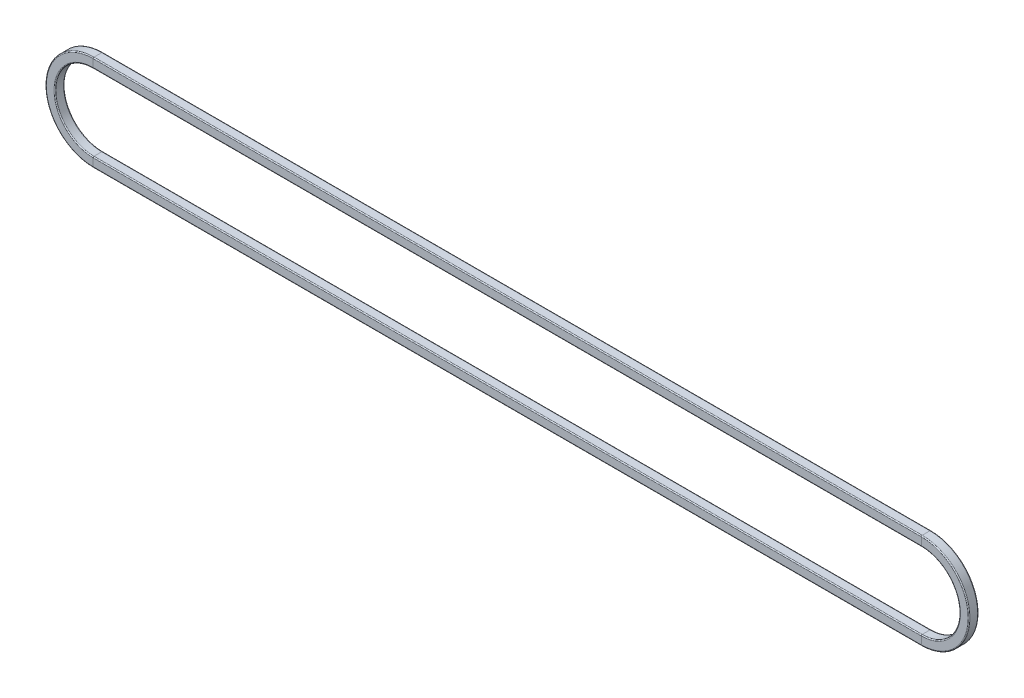
ISO-10303-21;
HEADER;
FILE_DESCRIPTION(('STEP AP214'),'2;1');
FILE_NAME('part.step','',(''),(''),'','','');
FILE_SCHEMA(('AUTOMOTIVE_DESIGN { 1 0 10303 214 1 1 1 1 }'));
ENDSEC;
DATA;
#1=APPLICATION_CONTEXT('core data for automotive mechanical design processes');
#2=APPLICATION_PROTOCOL_DEFINITION('international standard','automotive_design',2000,#1);
#3=PRODUCT_CONTEXT('',#1,'mechanical');
#4=PRODUCT('Part','Part','',(#3));
#5=PRODUCT_RELATED_PRODUCT_CATEGORY('part','',(#4));
#6=PRODUCT_DEFINITION_FORMATION('','',#4);
#7=PRODUCT_DEFINITION_CONTEXT('part definition',#1,'design');
#8=PRODUCT_DEFINITION('design','',#6,#7);
#9=PRODUCT_DEFINITION_SHAPE('','',#8);
#10=(LENGTH_UNIT() NAMED_UNIT(*) SI_UNIT(.MILLI.,.METRE.));
#11=(NAMED_UNIT(*) PLANE_ANGLE_UNIT() SI_UNIT($,.RADIAN.));
#12=(NAMED_UNIT(*) SI_UNIT($,.STERADIAN.) SOLID_ANGLE_UNIT());
#13=UNCERTAINTY_MEASURE_WITH_UNIT(LENGTH_MEASURE(1.E-05),#10,'distance_accuracy_value','');
#14=(GEOMETRIC_REPRESENTATION_CONTEXT(3) GLOBAL_UNCERTAINTY_ASSIGNED_CONTEXT((#13)) GLOBAL_UNIT_ASSIGNED_CONTEXT((#10,
#11,#12)) REPRESENTATION_CONTEXT('',''));
#15=CARTESIAN_POINT('',(0.,0.,0.));
#16=DIRECTION('',(0.,0.,1.));
#17=DIRECTION('',(1.,0.,0.));
#18=AXIS2_PLACEMENT_3D('',#15,#16,#17);
#19=CARTESIAN_POINT('',(86.80000000001,4.99999999999999,0.5));
#20=DIRECTION('',(0.,0.,-1.));
#21=DIRECTION('',(0.,1.,0.));
#22=AXIS2_PLACEMENT_3D('',#19,#20,#21);
#23=PLANE('',#22);
#24=DIRECTION('',(0.,-1.,0.));
#25=VECTOR('',#24,1.);
#26=CARTESIAN_POINT('',(0.,5.,0.5));
#27=LINE('',#26,#25);
#28=CARTESIAN_POINT('',(0.,4.9,0.5));
#29=VERTEX_POINT('',#28);
#30=CARTESIAN_POINT('',(0.,4.1,0.5));
#31=VERTEX_POINT('',#30);
#32=EDGE_CURVE('E256',#29,#31,#27,.T.);
#33=ORIENTED_EDGE('',*,*,#32,.T.);
#34=DIRECTION('',(-1.,0.,0.));
#35=VECTOR('',#34,1.);
#36=CARTESIAN_POINT('',(86.80000000001,4.09999999999999,0.5));
#37=LINE('',#36,#35);
#38=CARTESIAN_POINT('',(86.80000000001,4.09999999999999,0.5));
#39=VERTEX_POINT('',#38);
#40=EDGE_CURVE('E247',#31,#39,#37,.F.);
#41=ORIENTED_EDGE('',*,*,#40,.T.);
#42=DIRECTION('',(0.,-1.,0.));
#43=VECTOR('',#42,1.);
#44=CARTESIAN_POINT('',(86.80000000001,4.99999999999999,0.5));
#45=LINE('',#44,#43);
#46=CARTESIAN_POINT('',(86.80000000001,4.89999999999999,0.5));
#47=VERTEX_POINT('',#46);
#48=EDGE_CURVE('E321',#47,#39,#45,.T.);
#49=ORIENTED_EDGE('',*,*,#48,.F.);
#50=DIRECTION('',(-1.,0.,0.));
#51=VECTOR('',#50,1.);
#52=CARTESIAN_POINT('',(86.80000000001,4.89999999999999,0.5));
#53=LINE('',#52,#51);
#54=EDGE_CURVE('E245',#47,#29,#53,.T.);
#55=ORIENTED_EDGE('',*,*,#54,.T.);
#56=EDGE_LOOP('',(#33,#41,#49,#55));
#57=FACE_BOUND('',#56,.T.);
#58=ADVANCED_FACE('F34',(#57),#23,.F.);
#59=CARTESIAN_POINT('',(0.,5.,0.5));
#60=DIRECTION('',(0.,0.,-1.));
#61=DIRECTION('',(-1.,0.,0.));
#62=AXIS2_PLACEMENT_3D('',#59,#60,#61);
#63=PLANE('',#62);
#64=DIRECTION('',(0.,1.,0.));
#65=VECTOR('',#64,1.);
#66=CARTESIAN_POINT('',(0.,-5.,0.5));
#67=LINE('',#66,#65);
#68=CARTESIAN_POINT('',(0.,-4.89999999999907,0.5));
#69=VERTEX_POINT('',#68);
#70=CARTESIAN_POINT('',(0.,-4.09999999999907,0.5));
#71=VERTEX_POINT('',#70);
#72=EDGE_CURVE('E305',#69,#71,#67,.T.);
#73=ORIENTED_EDGE('',*,*,#72,.T.);
#74=CARTESIAN_POINT('',(-2.38004060904018E-11,4.64905891561784E-13,0.5));
#75=DIRECTION('',(0.,0.,-1.));
#76=DIRECTION('',(-1.,0.,0.));
#77=AXIS2_PLACEMENT_3D('',#74,#75,#76);
#78=CIRCLE('',#77,4.09999999999954);
#79=EDGE_CURVE('E222',#71,#31,#78,.T.);
#80=ORIENTED_EDGE('',*,*,#79,.T.);
#81=ORIENTED_EDGE('',*,*,#32,.F.);
#82=CARTESIAN_POINT('',(-2.38004060904018E-11,4.64905891561784E-13,0.5));
#83=DIRECTION('',(0.,0.,-1.));
#84=DIRECTION('',(-1.,0.,0.));
#85=AXIS2_PLACEMENT_3D('',#82,#83,#84);
#86=CIRCLE('',#85,4.89999999999953);
#87=EDGE_CURVE('E220',#29,#69,#86,.F.);
#88=ORIENTED_EDGE('',*,*,#87,.T.);
#89=EDGE_LOOP('',(#73,#80,#81,#88));
#90=FACE_BOUND('',#89,.T.);
#91=ADVANCED_FACE('F376',(#90),#63,.F.);
#92=CARTESIAN_POINT('',(-2.38004060904018E-11,4.64905891561784E-13,0.));
#93=DIRECTION('',(0.,0.,1.));
#94=DIRECTION('',(1.,0.,0.));
#95=AXIS2_PLACEMENT_3D('',#92,#93,#94);
#96=CYLINDRICAL_SURFACE('',#95,3.99999999999954);
#97=DIRECTION('',(0.,0.,-1.));
#98=VECTOR('',#97,1.);
#99=CARTESIAN_POINT('',(0.,-4.,0.5));
#100=LINE('',#99,#98);
#101=CARTESIAN_POINT('',(0.,-4.,0.4));
#102=VERTEX_POINT('',#101);
#103=CARTESIAN_POINT('',(0.,-4.,-0.4));
#104=VERTEX_POINT('',#103);
#105=EDGE_CURVE('E314',#102,#104,#100,.T.);
#106=ORIENTED_EDGE('',*,*,#105,.T.);
#107=CARTESIAN_POINT('',(-2.38004060904018E-11,4.64905891561784E-13,-0.4));
#108=DIRECTION('',(0.,0.,1.));
#109=DIRECTION('',(1.,0.,0.));
#110=AXIS2_PLACEMENT_3D('',#107,#108,#109);
#111=CIRCLE('',#110,3.99999999999954);
#112=CARTESIAN_POINT('',(0.,4.,-0.4));
#113=VERTEX_POINT('',#112);
#114=EDGE_CURVE('E208',#104,#113,#111,.F.);
#115=ORIENTED_EDGE('',*,*,#114,.T.);
#116=DIRECTION('',(0.,0.,-1.));
#117=VECTOR('',#116,1.);
#118=CARTESIAN_POINT('',(0.,4.,0.5));
#119=LINE('',#118,#117);
#120=CARTESIAN_POINT('',(0.,4.,0.4));
#121=VERTEX_POINT('',#120);
#122=EDGE_CURVE('E303',#121,#113,#119,.T.);
#123=ORIENTED_EDGE('',*,*,#122,.F.);
#124=CARTESIAN_POINT('',(-2.38004060904018E-11,4.64905891561784E-13,0.4));
#125=DIRECTION('',(0.,0.,-1.));
#126=DIRECTION('',(-1.,0.,0.));
#127=AXIS2_PLACEMENT_3D('',#124,#125,#126);
#128=CIRCLE('',#127,3.99999999999954);
#129=EDGE_CURVE('E206',#121,#102,#128,.F.);
#130=ORIENTED_EDGE('',*,*,#129,.T.);
#131=EDGE_LOOP('',(#106,#115,#123,#130));
#132=FACE_BOUND('',#131,.T.);
#133=ADVANCED_FACE('F409',(#132),#96,.F.);
#134=CARTESIAN_POINT('',(0.,5.,-0.5));
#135=DIRECTION('',(0.,0.,1.));
#136=DIRECTION('',(1.,0.,0.));
#137=AXIS2_PLACEMENT_3D('',#134,#135,#136);
#138=PLANE('',#137);
#139=DIRECTION('',(0.,1.,0.));
#140=VECTOR('',#139,1.);
#141=CARTESIAN_POINT('',(0.,5.,-0.5));
#142=LINE('',#141,#140);
#143=CARTESIAN_POINT('',(0.,4.1,-0.5));
#144=VERTEX_POINT('',#143);
#145=CARTESIAN_POINT('',(0.,4.9,-0.5));
#146=VERTEX_POINT('',#145);
#147=EDGE_CURVE('E298',#144,#146,#142,.T.);
#148=ORIENTED_EDGE('',*,*,#147,.F.);
#149=CARTESIAN_POINT('',(-2.38004060904018E-11,4.64905891561784E-13,-0.5));
#150=DIRECTION('',(0.,0.,1.));
#151=DIRECTION('',(1.,0.,0.));
#152=AXIS2_PLACEMENT_3D('',#149,#150,#151);
#153=CIRCLE('',#152,4.09999999999954);
#154=CARTESIAN_POINT('',(0.,-4.09999999999907,-0.5));
#155=VERTEX_POINT('',#154);
#156=EDGE_CURVE('E204',#144,#155,#153,.T.);
#157=ORIENTED_EDGE('',*,*,#156,.T.);
#158=DIRECTION('',(0.,-1.,0.));
#159=VECTOR('',#158,1.);
#160=CARTESIAN_POINT('',(0.,-5.,-0.5));
#161=LINE('',#160,#159);
#162=CARTESIAN_POINT('',(0.,-4.89999999999907,-0.5));
#163=VERTEX_POINT('',#162);
#164=EDGE_CURVE('E155',#155,#163,#161,.T.);
#165=ORIENTED_EDGE('',*,*,#164,.T.);
#166=CARTESIAN_POINT('',(-2.38004060904018E-11,4.64905891561784E-13,-0.5));
#167=DIRECTION('',(0.,0.,1.));
#168=DIRECTION('',(1.,0.,0.));
#169=AXIS2_PLACEMENT_3D('',#166,#167,#168);
#170=CIRCLE('',#169,4.89999999999953);
#171=EDGE_CURVE('E202',#163,#146,#170,.F.);
#172=ORIENTED_EDGE('',*,*,#171,.T.);
#173=EDGE_LOOP('',(#148,#157,#165,#172));
#174=FACE_BOUND('',#173,.T.);
#175=ADVANCED_FACE('F297',(#174),#138,.F.);
#176=CARTESIAN_POINT('',(-2.38004060904018E-11,4.64905891561784E-13,0.));
#177=DIRECTION('',(0.,0.,1.));
#178=DIRECTION('',(1.,0.,0.));
#179=AXIS2_PLACEMENT_3D('',#176,#177,#178);
#180=CYLINDRICAL_SURFACE('',#179,4.99999999999953);
#181=DIRECTION('',(0.,0.,1.));
#182=VECTOR('',#181,1.);
#183=CARTESIAN_POINT('',(0.,-5.,0.5));
#184=LINE('',#183,#182);
#185=CARTESIAN_POINT('',(0.,-5.,-0.4));
#186=VERTEX_POINT('',#185);
#187=CARTESIAN_POINT('',(0.,-5.,0.4));
#188=VERTEX_POINT('',#187);
#189=EDGE_CURVE('E313',#186,#188,#184,.T.);
#190=ORIENTED_EDGE('',*,*,#189,.T.);
#191=CARTESIAN_POINT('',(-2.38004060904018E-11,4.64905891561784E-13,0.4));
#192=DIRECTION('',(0.,0.,-1.));
#193=DIRECTION('',(-1.,0.,0.));
#194=AXIS2_PLACEMENT_3D('',#191,#192,#193);
#195=CIRCLE('',#194,4.99999999999953);
#196=CARTESIAN_POINT('',(0.,5.,0.4));
#197=VERTEX_POINT('',#196);
#198=EDGE_CURVE('E51',#188,#197,#195,.T.);
#199=ORIENTED_EDGE('',*,*,#198,.T.);
#200=DIRECTION('',(0.,0.,1.));
#201=VECTOR('',#200,1.);
#202=CARTESIAN_POINT('',(0.,5.,0.5));
#203=LINE('',#202,#201);
#204=CARTESIAN_POINT('',(0.,5.,-0.4));
#205=VERTEX_POINT('',#204);
#206=EDGE_CURVE('E302',#205,#197,#203,.T.);
#207=ORIENTED_EDGE('',*,*,#206,.F.);
#208=CARTESIAN_POINT('',(-2.38004060904018E-11,4.64905891561784E-13,-0.4));
#209=DIRECTION('',(0.,0.,1.));
#210=DIRECTION('',(1.,0.,0.));
#211=AXIS2_PLACEMENT_3D('',#208,#209,#210);
#212=CIRCLE('',#211,4.99999999999953);
#213=EDGE_CURVE('E234',#205,#186,#212,.T.);
#214=ORIENTED_EDGE('',*,*,#213,.T.);
#215=EDGE_LOOP('',(#190,#199,#207,#214));
#216=FACE_BOUND('',#215,.T.);
#217=ADVANCED_FACE('F371',(#216),#180,.T.);
#218=CARTESIAN_POINT('',(0.,-5.,0.5));
#219=DIRECTION('',(0.,0.,-1.));
#220=DIRECTION('',(0.,1.,0.));
#221=AXIS2_PLACEMENT_3D('',#218,#219,#220);
#222=PLANE('',#221);
#223=DIRECTION('',(0.,1.,0.));
#224=VECTOR('',#223,1.);
#225=CARTESIAN_POINT('',(86.7999999999624,-4.99999999999908,0.5));
#226=LINE('',#225,#224);
#227=CARTESIAN_POINT('',(86.7999999999624,-4.90000000000001,0.5));
#228=VERTEX_POINT('',#227);
#229=CARTESIAN_POINT('',(86.7999999999624,-4.10000000000001,0.5));
#230=VERTEX_POINT('',#229);
#231=EDGE_CURVE('E319',#228,#230,#226,.T.);
#232=ORIENTED_EDGE('',*,*,#231,.T.);
#233=DIRECTION('',(1.,0.,0.));
#234=VECTOR('',#233,1.);
#235=CARTESIAN_POINT('',(0.,-4.1,0.5));
#236=LINE('',#235,#234);
#237=EDGE_CURVE('E218',#230,#71,#236,.F.);
#238=ORIENTED_EDGE('',*,*,#237,.T.);
#239=ORIENTED_EDGE('',*,*,#72,.F.);
#240=DIRECTION('',(1.,0.,0.));
#241=VECTOR('',#240,1.);
#242=CARTESIAN_POINT('',(0.,-4.9,0.5));
#243=LINE('',#242,#241);
#244=EDGE_CURVE('E216',#69,#228,#243,.T.);
#245=ORIENTED_EDGE('',*,*,#244,.T.);
#246=EDGE_LOOP('',(#232,#238,#239,#245));
#247=FACE_BOUND('',#246,.T.);
#248=ADVANCED_FACE('F360',(#247),#222,.F.);
#249=CARTESIAN_POINT('',(0.,-4.,0.5));
#250=DIRECTION('',(0.,-1.,0.));
#251=DIRECTION('',(1.,0.,0.));
#252=AXIS2_PLACEMENT_3D('',#249,#250,#251);
#253=PLANE('',#252);
#254=DIRECTION('',(0.,0.,-1.));
#255=VECTOR('',#254,1.);
#256=CARTESIAN_POINT('',(86.7999999999624,-3.99999999999908,0.5));
#257=LINE('',#256,#255);
#258=CARTESIAN_POINT('',(86.7999999999624,-3.99999999999908,0.4));
#259=VERTEX_POINT('',#258);
#260=CARTESIAN_POINT('',(86.7999999999624,-3.99999999999908,-0.4));
#261=VERTEX_POINT('',#260);
#262=EDGE_CURVE('E174',#259,#261,#257,.T.);
#263=ORIENTED_EDGE('',*,*,#262,.T.);
#264=DIRECTION('',(1.,0.,0.));
#265=VECTOR('',#264,1.);
#266=CARTESIAN_POINT('',(0.,-4.,-0.4));
#267=LINE('',#266,#265);
#268=EDGE_CURVE('E179',#261,#104,#267,.F.);
#269=ORIENTED_EDGE('',*,*,#268,.T.);
#270=ORIENTED_EDGE('',*,*,#105,.F.);
#271=DIRECTION('',(1.,0.,0.));
#272=VECTOR('',#271,1.);
#273=CARTESIAN_POINT('',(0.,-4.,0.4));
#274=LINE('',#273,#272);
#275=EDGE_CURVE('E160',#102,#259,#274,.T.);
#276=ORIENTED_EDGE('',*,*,#275,.T.);
#277=EDGE_LOOP('',(#263,#269,#270,#276));
#278=FACE_BOUND('',#277,.T.);
#279=ADVANCED_FACE('F396',(#278),#253,.F.);
#280=CARTESIAN_POINT('',(0.,-5.,-0.5));
#281=DIRECTION('',(0.,0.,1.));
#282=DIRECTION('',(0.,-1.,0.));
#283=AXIS2_PLACEMENT_3D('',#280,#281,#282);
#284=PLANE('',#283);
#285=ORIENTED_EDGE('',*,*,#164,.F.);
#286=DIRECTION('',(1.,0.,0.));
#287=VECTOR('',#286,1.);
#288=CARTESIAN_POINT('',(0.,-4.1,-0.5));
#289=LINE('',#288,#287);
#290=CARTESIAN_POINT('',(86.7999999999624,-4.10000000000001,-0.5));
#291=VERTEX_POINT('',#290);
#292=EDGE_CURVE('E150',#155,#291,#289,.T.);
#293=ORIENTED_EDGE('',*,*,#292,.T.);
#294=DIRECTION('',(0.,-1.,0.));
#295=VECTOR('',#294,1.);
#296=CARTESIAN_POINT('',(86.7999999999624,-4.99999999999908,-0.5));
#297=LINE('',#296,#295);
#298=CARTESIAN_POINT('',(86.7999999999624,-4.90000000000001,-0.5));
#299=VERTEX_POINT('',#298);
#300=EDGE_CURVE('E153',#291,#299,#297,.T.);
#301=ORIENTED_EDGE('',*,*,#300,.T.);
#302=DIRECTION('',(1.,0.,0.));
#303=VECTOR('',#302,1.);
#304=CARTESIAN_POINT('',(0.,-4.9,-0.5));
#305=LINE('',#304,#303);
#306=EDGE_CURVE('E161',#299,#163,#305,.F.);
#307=ORIENTED_EDGE('',*,*,#306,.T.);
#308=EDGE_LOOP('',(#285,#293,#301,#307));
#309=FACE_BOUND('',#308,.T.);
#310=ADVANCED_FACE('F152',(#309),#284,.F.);
#311=CARTESIAN_POINT('',(0.,-5.,0.5));
#312=DIRECTION('',(0.,1.,0.));
#313=DIRECTION('',(-1.,0.,0.));
#314=AXIS2_PLACEMENT_3D('',#311,#312,#313);
#315=PLANE('',#314);
#316=DIRECTION('',(0.,0.,1.));
#317=VECTOR('',#316,1.);
#318=CARTESIAN_POINT('',(86.7999999999624,-4.99999999999908,0.5));
#319=LINE('',#318,#317);
#320=CARTESIAN_POINT('',(86.7999999999624,-4.99999999999908,-0.4));
#321=VERTEX_POINT('',#320);
#322=CARTESIAN_POINT('',(86.7999999999624,-4.99999999999908,0.4));
#323=VERTEX_POINT('',#322);
#324=EDGE_CURVE('E173',#321,#323,#319,.T.);
#325=ORIENTED_EDGE('',*,*,#324,.T.);
#326=DIRECTION('',(1.,0.,0.));
#327=VECTOR('',#326,1.);
#328=CARTESIAN_POINT('',(0.,-5.,0.4));
#329=LINE('',#328,#327);
#330=EDGE_CURVE('E232',#323,#188,#329,.F.);
#331=ORIENTED_EDGE('',*,*,#330,.T.);
#332=ORIENTED_EDGE('',*,*,#189,.F.);
#333=DIRECTION('',(1.,0.,0.));
#334=VECTOR('',#333,1.);
#335=CARTESIAN_POINT('',(0.,-5.,-0.4));
#336=LINE('',#335,#334);
#337=EDGE_CURVE('E230',#186,#321,#336,.T.);
#338=ORIENTED_EDGE('',*,*,#337,.T.);
#339=EDGE_LOOP('',(#325,#331,#332,#338));
#340=FACE_BOUND('',#339,.T.);
#341=ADVANCED_FACE('F370',(#340),#315,.F.);
#342=CARTESIAN_POINT('',(86.7999999999624,-4.99999999999908,0.5));
#343=DIRECTION('',(0.,0.,-1.));
#344=DIRECTION('',(-1.,0.,0.));
#345=AXIS2_PLACEMENT_3D('',#342,#343,#344);
#346=PLANE('',#345);
#347=ORIENTED_EDGE('',*,*,#48,.T.);
#348=CARTESIAN_POINT('',(86.7999999999862,4.57966997657877E-13,0.5));
#349=DIRECTION('',(0.,0.,-1.));
#350=DIRECTION('',(-1.,0.,0.));
#351=AXIS2_PLACEMENT_3D('',#348,#349,#350);
#352=CIRCLE('',#351,4.09999999999954);
#353=EDGE_CURVE('E213',#39,#230,#352,.T.);
#354=ORIENTED_EDGE('',*,*,#353,.T.);
#355=ORIENTED_EDGE('',*,*,#231,.F.);
#356=CARTESIAN_POINT('',(86.7999999999862,4.57966997657877E-13,0.5));
#357=DIRECTION('',(0.,0.,-1.));
#358=DIRECTION('',(-1.,0.,0.));
#359=AXIS2_PLACEMENT_3D('',#356,#357,#358);
#360=CIRCLE('',#359,4.89999999999953);
#361=EDGE_CURVE('E210',#228,#47,#360,.F.);
#362=ORIENTED_EDGE('',*,*,#361,.T.);
#363=EDGE_LOOP('',(#347,#354,#355,#362));
#364=FACE_BOUND('',#363,.T.);
#365=ADVANCED_FACE('F346',(#364),#346,.F.);
#366=CARTESIAN_POINT('',(86.7999999999862,4.57966997657877E-13,0.));
#367=DIRECTION('',(0.,0.,1.));
#368=DIRECTION('',(1.,0.,0.));
#369=AXIS2_PLACEMENT_3D('',#366,#367,#368);
#370=CYLINDRICAL_SURFACE('',#369,3.99999999999954);
#371=DIRECTION('',(0.,0.,-1.));
#372=VECTOR('',#371,1.);
#373=CARTESIAN_POINT('',(86.80000000001,3.99999999999999,0.5));
#374=LINE('',#373,#372);
#375=CARTESIAN_POINT('',(86.80000000001,3.99999999999999,0.4));
#376=VERTEX_POINT('',#375);
#377=CARTESIAN_POINT('',(86.80000000001,3.99999999999999,-0.4));
#378=VERTEX_POINT('',#377);
#379=EDGE_CURVE('E311',#376,#378,#374,.T.);
#380=ORIENTED_EDGE('',*,*,#379,.T.);
#381=CARTESIAN_POINT('',(86.7999999999862,4.57966997657877E-13,-0.4));
#382=DIRECTION('',(0.,0.,1.));
#383=DIRECTION('',(1.,0.,0.));
#384=AXIS2_PLACEMENT_3D('',#381,#382,#383);
#385=CIRCLE('',#384,3.99999999999954);
#386=EDGE_CURVE('E192',#378,#261,#385,.F.);
#387=ORIENTED_EDGE('',*,*,#386,.T.);
#388=ORIENTED_EDGE('',*,*,#262,.F.);
#389=CARTESIAN_POINT('',(86.7999999999862,4.57966997657877E-13,0.4));
#390=DIRECTION('',(0.,0.,-1.));
#391=DIRECTION('',(-1.,0.,0.));
#392=AXIS2_PLACEMENT_3D('',#389,#390,#391);
#393=CIRCLE('',#392,3.99999999999954);
#394=EDGE_CURVE('E189',#259,#376,#393,.F.);
#395=ORIENTED_EDGE('',*,*,#394,.T.);
#396=EDGE_LOOP('',(#380,#387,#388,#395));
#397=FACE_BOUND('',#396,.T.);
#398=ADVANCED_FACE('F398',(#397),#370,.F.);
#399=CARTESIAN_POINT('',(86.7999999999624,-4.99999999999908,-0.5));
#400=DIRECTION('',(0.,0.,1.));
#401=DIRECTION('',(1.,0.,0.));
#402=AXIS2_PLACEMENT_3D('',#399,#400,#401);
#403=PLANE('',#402);
#404=ORIENTED_EDGE('',*,*,#300,.F.);
#405=CARTESIAN_POINT('',(86.7999999999862,4.57966997657877E-13,-0.5));
#406=DIRECTION('',(0.,0.,1.));
#407=DIRECTION('',(1.,0.,0.));
#408=AXIS2_PLACEMENT_3D('',#405,#406,#407);
#409=CIRCLE('',#408,4.09999999999954);
#410=CARTESIAN_POINT('',(86.80000000001,4.09999999999999,-0.5));
#411=VERTEX_POINT('',#410);
#412=EDGE_CURVE('E169',#291,#411,#409,.T.);
#413=ORIENTED_EDGE('',*,*,#412,.T.);
#414=DIRECTION('',(0.,1.,0.));
#415=VECTOR('',#414,1.);
#416=CARTESIAN_POINT('',(86.80000000001,4.99999999999999,-0.5));
#417=LINE('',#416,#415);
#418=CARTESIAN_POINT('',(86.80000000001,4.89999999999999,-0.5));
#419=VERTEX_POINT('',#418);
#420=EDGE_CURVE('E316',#411,#419,#417,.T.);
#421=ORIENTED_EDGE('',*,*,#420,.T.);
#422=CARTESIAN_POINT('',(86.7999999999862,4.57966997657877E-13,-0.5));
#423=DIRECTION('',(0.,0.,1.));
#424=DIRECTION('',(1.,0.,0.));
#425=AXIS2_PLACEMENT_3D('',#422,#423,#424);
#426=CIRCLE('',#425,4.89999999999953);
#427=EDGE_CURVE('E172',#419,#299,#426,.F.);
#428=ORIENTED_EDGE('',*,*,#427,.T.);
#429=EDGE_LOOP('',(#404,#413,#421,#428));
#430=FACE_BOUND('',#429,.T.);
#431=ADVANCED_FACE('F166',(#430),#403,.F.);
#432=CARTESIAN_POINT('',(86.7999999999862,4.57966997657877E-13,0.));
#433=DIRECTION('',(0.,0.,1.));
#434=DIRECTION('',(1.,0.,0.));
#435=AXIS2_PLACEMENT_3D('',#432,#433,#434);
#436=CYLINDRICAL_SURFACE('',#435,4.99999999999953);
#437=DIRECTION('',(0.,0.,1.));
#438=VECTOR('',#437,1.);
#439=CARTESIAN_POINT('',(86.80000000001,4.99999999999999,0.5));
#440=LINE('',#439,#438);
#441=CARTESIAN_POINT('',(86.80000000001,4.99999999999999,-0.4));
#442=VERTEX_POINT('',#441);
#443=CARTESIAN_POINT('',(86.80000000001,4.99999999999999,0.4));
#444=VERTEX_POINT('',#443);
#445=EDGE_CURVE('E194',#442,#444,#440,.T.);
#446=ORIENTED_EDGE('',*,*,#445,.T.);
#447=CARTESIAN_POINT('',(86.7999999999862,4.57966997657877E-13,0.4));
#448=DIRECTION('',(0.,0.,-1.));
#449=DIRECTION('',(-1.,0.,0.));
#450=AXIS2_PLACEMENT_3D('',#447,#448,#449);
#451=CIRCLE('',#450,4.99999999999953);
#452=EDGE_CURVE('E227',#444,#323,#451,.T.);
#453=ORIENTED_EDGE('',*,*,#452,.T.);
#454=ORIENTED_EDGE('',*,*,#324,.F.);
#455=CARTESIAN_POINT('',(86.7999999999862,4.57966997657877E-13,-0.4));
#456=DIRECTION('',(0.,0.,1.));
#457=DIRECTION('',(1.,0.,0.));
#458=AXIS2_PLACEMENT_3D('',#455,#456,#457);
#459=CIRCLE('',#458,4.99999999999953);
#460=EDGE_CURVE('E224',#321,#442,#459,.T.);
#461=ORIENTED_EDGE('',*,*,#460,.T.);
#462=EDGE_LOOP('',(#446,#453,#454,#461));
#463=FACE_BOUND('',#462,.T.);
#464=ADVANCED_FACE('F325',(#463),#436,.T.);
#465=CARTESIAN_POINT('',(86.80000000001,3.99999999999999,0.5));
#466=DIRECTION('',(0.,1.,0.));
#467=DIRECTION('',(-1.,0.,0.));
#468=AXIS2_PLACEMENT_3D('',#465,#466,#467);
#469=PLANE('',#468);
#470=ORIENTED_EDGE('',*,*,#122,.T.);
#471=DIRECTION('',(-1.,0.,0.));
#472=VECTOR('',#471,1.);
#473=CARTESIAN_POINT('',(86.80000000001,3.99999999999999,-0.4));
#474=LINE('',#473,#472);
#475=EDGE_CURVE('E243',#113,#378,#474,.F.);
#476=ORIENTED_EDGE('',*,*,#475,.T.);
#477=ORIENTED_EDGE('',*,*,#379,.F.);
#478=DIRECTION('',(-1.,0.,0.));
#479=VECTOR('',#478,1.);
#480=CARTESIAN_POINT('',(86.80000000001,3.99999999999999,0.4));
#481=LINE('',#480,#479);
#482=EDGE_CURVE('E241',#376,#121,#481,.T.);
#483=ORIENTED_EDGE('',*,*,#482,.T.);
#484=EDGE_LOOP('',(#470,#476,#477,#483));
#485=FACE_BOUND('',#484,.T.);
#486=ADVANCED_FACE('F411',(#485),#469,.F.);
#487=CARTESIAN_POINT('',(86.80000000001,4.99999999999999,-0.5));
#488=DIRECTION('',(0.,0.,1.));
#489=DIRECTION('',(0.,-1.,0.));
#490=AXIS2_PLACEMENT_3D('',#487,#488,#489);
#491=PLANE('',#490);
#492=ORIENTED_EDGE('',*,*,#420,.F.);
#493=DIRECTION('',(-1.,0.,0.));
#494=VECTOR('',#493,1.);
#495=CARTESIAN_POINT('',(86.80000000001,4.09999999999999,-0.5));
#496=LINE('',#495,#494);
#497=EDGE_CURVE('E239',#411,#144,#496,.T.);
#498=ORIENTED_EDGE('',*,*,#497,.T.);
#499=ORIENTED_EDGE('',*,*,#147,.T.);
#500=DIRECTION('',(-1.,0.,0.));
#501=VECTOR('',#500,1.);
#502=CARTESIAN_POINT('',(86.80000000001,4.89999999999999,-0.5));
#503=LINE('',#502,#501);
#504=EDGE_CURVE('E237',#146,#419,#503,.F.);
#505=ORIENTED_EDGE('',*,*,#504,.T.);
#506=EDGE_LOOP('',(#492,#498,#499,#505));
#507=FACE_BOUND('',#506,.T.);
#508=ADVANCED_FACE('F301',(#507),#491,.F.);
#509=CARTESIAN_POINT('',(86.80000000001,4.99999999999999,0.5));
#510=DIRECTION('',(0.,-1.,0.));
#511=DIRECTION('',(1.,0.,0.));
#512=AXIS2_PLACEMENT_3D('',#509,#510,#511);
#513=PLANE('',#512);
#514=ORIENTED_EDGE('',*,*,#206,.T.);
#515=DIRECTION('',(-1.,0.,0.));
#516=VECTOR('',#515,1.);
#517=CARTESIAN_POINT('',(86.80000000001,4.99999999999999,0.4));
#518=LINE('',#517,#516);
#519=EDGE_CURVE('E11',#197,#444,#518,.F.);
#520=ORIENTED_EDGE('',*,*,#519,.T.);
#521=ORIENTED_EDGE('',*,*,#445,.F.);
#522=DIRECTION('',(-1.,0.,0.));
#523=VECTOR('',#522,1.);
#524=CARTESIAN_POINT('',(86.80000000001,4.99999999999999,-0.4));
#525=LINE('',#524,#523);
#526=EDGE_CURVE('E43',#442,#205,#525,.T.);
#527=ORIENTED_EDGE('',*,*,#526,.T.);
#528=EDGE_LOOP('',(#514,#520,#521,#527));
#529=FACE_BOUND('',#528,.T.);
#530=ADVANCED_FACE('F418',(#529),#513,.F.);
#531=CARTESIAN_POINT('',(-2.38004060904018E-11,4.64905891561784E-13,-0.4));
#532=DIRECTION('',(0.,0.,1.));
#533=DIRECTION('',(1.,0.,0.));
#534=AXIS2_PLACEMENT_3D('',#531,#532,#533);
#535=TOROIDAL_SURFACE('',#534,4.09999999999954,0.1);
#536=CARTESIAN_POINT('',(5.95010152260114E-13,4.1,-0.4));
#537=DIRECTION('',(1.,-5.95010152260113E-12,-5.95010152260114E-12));
#538=DIRECTION('',(-5.95010152260114E-12,0.,-1.));
#539=AXIS2_PLACEMENT_3D('',#536,#537,#538);
#540=CIRCLE('',#539,0.1);
#541=EDGE_CURVE('E183',#113,#144,#540,.T.);
#542=ORIENTED_EDGE('',*,*,#541,.F.);
#543=ORIENTED_EDGE('',*,*,#114,.F.);
#544=CARTESIAN_POINT('',(0.,-4.09999999999907,-0.4));
#545=DIRECTION('',(1.,0.,0.));
#546=DIRECTION('',(0.,1.,0.));
#547=AXIS2_PLACEMENT_3D('',#544,#545,#546);
#548=CIRCLE('',#547,0.1);
#549=EDGE_CURVE('E254',#155,#104,#548,.T.);
#550=ORIENTED_EDGE('',*,*,#549,.F.);
#551=ORIENTED_EDGE('',*,*,#156,.F.);
#552=EDGE_LOOP('',(#542,#543,#550,#551));
#553=FACE_BOUND('',#552,.T.);
#554=ADVANCED_FACE('F406',(#553),#535,.T.);
#555=CARTESIAN_POINT('',(0.,-4.1,-0.4));
#556=DIRECTION('',(1.,0.,0.));
#557=DIRECTION('',(0.,1.,0.));
#558=AXIS2_PLACEMENT_3D('',#555,#556,#557);
#559=CYLINDRICAL_SURFACE('',#558,0.1);
#560=ORIENTED_EDGE('',*,*,#549,.T.);
#561=ORIENTED_EDGE('',*,*,#268,.F.);
#562=CARTESIAN_POINT('',(86.7999999999624,-4.10000000000001,-0.4));
#563=DIRECTION('',(1.,0.,0.));
#564=DIRECTION('',(0.,0.,-1.));
#565=AXIS2_PLACEMENT_3D('',#562,#563,#564);
#566=CIRCLE('',#565,0.1);
#567=EDGE_CURVE('E177',#291,#261,#566,.T.);
#568=ORIENTED_EDGE('',*,*,#567,.F.);
#569=ORIENTED_EDGE('',*,*,#292,.F.);
#570=EDGE_LOOP('',(#560,#561,#568,#569));
#571=FACE_BOUND('',#570,.T.);
#572=ADVANCED_FACE('F178',(#571),#559,.T.);
#573=CARTESIAN_POINT('',(86.80000000001,4.09999999999999,-0.4));
#574=DIRECTION('',(-1.,0.,0.));
#575=DIRECTION('',(0.,-1.,0.));
#576=AXIS2_PLACEMENT_3D('',#573,#574,#575);
#577=CYLINDRICAL_SURFACE('',#576,0.1);
#578=ORIENTED_EDGE('',*,*,#541,.T.);
#579=ORIENTED_EDGE('',*,*,#497,.F.);
#580=CARTESIAN_POINT('',(86.80000000001,4.09999999999999,-0.4));
#581=DIRECTION('',(1.,0.,0.));
#582=DIRECTION('',(0.,0.,-1.));
#583=AXIS2_PLACEMENT_3D('',#580,#581,#582);
#584=CIRCLE('',#583,0.1);
#585=EDGE_CURVE('E184',#378,#411,#584,.T.);
#586=ORIENTED_EDGE('',*,*,#585,.F.);
#587=ORIENTED_EDGE('',*,*,#475,.F.);
#588=EDGE_LOOP('',(#578,#579,#586,#587));
#589=FACE_BOUND('',#588,.T.);
#590=ADVANCED_FACE('F402',(#589),#577,.T.);
#591=CARTESIAN_POINT('',(86.7999999999862,4.57966997657877E-13,-0.4));
#592=DIRECTION('',(0.,0.,1.));
#593=DIRECTION('',(1.,0.,0.));
#594=AXIS2_PLACEMENT_3D('',#591,#592,#593);
#595=TOROIDAL_SURFACE('',#594,4.09999999999954,0.1);
#596=ORIENTED_EDGE('',*,*,#567,.T.);
#597=ORIENTED_EDGE('',*,*,#386,.F.);
#598=ORIENTED_EDGE('',*,*,#585,.T.);
#599=ORIENTED_EDGE('',*,*,#412,.F.);
#600=EDGE_LOOP('',(#596,#597,#598,#599));
#601=FACE_BOUND('',#600,.T.);
#602=ADVANCED_FACE('F186',(#601),#595,.T.);
#603=CARTESIAN_POINT('',(-2.38004060904018E-11,4.64905891561784E-13,0.4));
#604=DIRECTION('',(0.,0.,-1.));
#605=DIRECTION('',(-1.,0.,0.));
#606=AXIS2_PLACEMENT_3D('',#603,#604,#605);
#607=TOROIDAL_SURFACE('',#606,4.09999999999954,0.1);
#608=CARTESIAN_POINT('',(0.,4.1,0.4));
#609=DIRECTION('',(1.,0.,0.));
#610=DIRECTION('',(0.,0.,-1.));
#611=AXIS2_PLACEMENT_3D('',#608,#609,#610);
#612=CIRCLE('',#611,0.1);
#613=EDGE_CURVE('E262',#31,#121,#612,.T.);
#614=ORIENTED_EDGE('',*,*,#613,.F.);
#615=ORIENTED_EDGE('',*,*,#79,.F.);
#616=CARTESIAN_POINT('',(5.95512257442094E-13,-4.09999999999907,0.4));
#617=DIRECTION('',(1.,5.95022398727966E-12,5.95010152259841E-12));
#618=DIRECTION('',(-5.95022398727966E-12,1.,0.));
#619=AXIS2_PLACEMENT_3D('',#616,#617,#618);
#620=CIRCLE('',#619,0.1);
#621=EDGE_CURVE('E250',#102,#71,#620,.T.);
#622=ORIENTED_EDGE('',*,*,#621,.F.);
#623=ORIENTED_EDGE('',*,*,#129,.F.);
#624=EDGE_LOOP('',(#614,#615,#622,#623));
#625=FACE_BOUND('',#624,.T.);
#626=ADVANCED_FACE('F382',(#625),#607,.T.);
#627=CARTESIAN_POINT('',(0.,-4.1,0.4));
#628=DIRECTION('',(1.,0.,0.));
#629=DIRECTION('',(0.,1.,0.));
#630=AXIS2_PLACEMENT_3D('',#627,#628,#629);
#631=CYLINDRICAL_SURFACE('',#630,0.1);
#632=ORIENTED_EDGE('',*,*,#621,.T.);
#633=ORIENTED_EDGE('',*,*,#237,.F.);
#634=CARTESIAN_POINT('',(86.7999999999624,-4.10000000000001,0.4));
#635=DIRECTION('',(1.,0.,0.));
#636=DIRECTION('',(0.,0.,-1.));
#637=AXIS2_PLACEMENT_3D('',#634,#635,#636);
#638=CIRCLE('',#637,0.1);
#639=EDGE_CURVE('E259',#259,#230,#638,.T.);
#640=ORIENTED_EDGE('',*,*,#639,.F.);
#641=ORIENTED_EDGE('',*,*,#275,.F.);
#642=EDGE_LOOP('',(#632,#633,#640,#641));
#643=FACE_BOUND('',#642,.T.);
#644=ADVANCED_FACE('F394',(#643),#631,.T.);
#645=CARTESIAN_POINT('',(86.80000000001,4.09999999999999,0.4));
#646=DIRECTION('',(-1.,0.,0.));
#647=DIRECTION('',(0.,-1.,0.));
#648=AXIS2_PLACEMENT_3D('',#645,#646,#647);
#649=CYLINDRICAL_SURFACE('',#648,0.1);
#650=ORIENTED_EDGE('',*,*,#613,.T.);
#651=ORIENTED_EDGE('',*,*,#482,.F.);
#652=CARTESIAN_POINT('',(86.80000000001,4.09999999999999,0.4));
#653=DIRECTION('',(1.,0.,0.));
#654=DIRECTION('',(0.,0.,-1.));
#655=AXIS2_PLACEMENT_3D('',#652,#653,#654);
#656=CIRCLE('',#655,0.1);
#657=EDGE_CURVE('E257',#39,#376,#656,.T.);
#658=ORIENTED_EDGE('',*,*,#657,.F.);
#659=ORIENTED_EDGE('',*,*,#40,.F.);
#660=EDGE_LOOP('',(#650,#651,#658,#659));
#661=FACE_BOUND('',#660,.T.);
#662=ADVANCED_FACE('F387',(#661),#649,.T.);
#663=CARTESIAN_POINT('',(86.7999999999862,4.57966997657877E-13,0.4));
#664=DIRECTION('',(0.,0.,-1.));
#665=DIRECTION('',(-1.,0.,0.));
#666=AXIS2_PLACEMENT_3D('',#663,#664,#665);
#667=TOROIDAL_SURFACE('',#666,4.09999999999954,0.1);
#668=ORIENTED_EDGE('',*,*,#639,.T.);
#669=ORIENTED_EDGE('',*,*,#353,.F.);
#670=ORIENTED_EDGE('',*,*,#657,.T.);
#671=ORIENTED_EDGE('',*,*,#394,.F.);
#672=EDGE_LOOP('',(#668,#669,#670,#671));
#673=FACE_BOUND('',#672,.T.);
#674=ADVANCED_FACE('F390',(#673),#667,.T.);
#675=CARTESIAN_POINT('',(-2.38004060904018E-11,4.64905891561784E-13,0.4));
#676=DIRECTION('',(0.,0.,-1.));
#677=DIRECTION('',(-1.,0.,0.));
#678=AXIS2_PLACEMENT_3D('',#675,#676,#677);
#679=TOROIDAL_SURFACE('',#678,4.89999999999953,0.1);
#680=CARTESIAN_POINT('',(-4.7600812180808E-13,4.9,0.4));
#681=DIRECTION('',(1.,-4.76008121808079E-12,-4.76008121808076E-12));
#682=DIRECTION('',(4.76008121808079E-12,1.,0.));
#683=AXIS2_PLACEMENT_3D('',#680,#681,#682);
#684=CIRCLE('',#683,0.1);
#685=EDGE_CURVE('E271',#197,#29,#684,.T.);
#686=ORIENTED_EDGE('',*,*,#685,.F.);
#687=ORIENTED_EDGE('',*,*,#198,.F.);
#688=CARTESIAN_POINT('',(0.,-4.89999999999907,0.4));
#689=DIRECTION('',(1.,0.,0.));
#690=DIRECTION('',(0.,1.,0.));
#691=AXIS2_PLACEMENT_3D('',#688,#689,#690);
#692=CIRCLE('',#691,0.1);
#693=EDGE_CURVE('E260',#69,#188,#692,.T.);
#694=ORIENTED_EDGE('',*,*,#693,.F.);
#695=ORIENTED_EDGE('',*,*,#87,.F.);
#696=EDGE_LOOP('',(#686,#687,#694,#695));
#697=FACE_BOUND('',#696,.T.);
#698=ADVANCED_FACE('F373',(#697),#679,.T.);
#699=CARTESIAN_POINT('',(0.,-4.9,0.4));
#700=DIRECTION('',(1.,0.,0.));
#701=DIRECTION('',(0.,1.,0.));
#702=AXIS2_PLACEMENT_3D('',#699,#700,#701);
#703=CYLINDRICAL_SURFACE('',#702,0.1);
#704=ORIENTED_EDGE('',*,*,#693,.T.);
#705=ORIENTED_EDGE('',*,*,#330,.F.);
#706=CARTESIAN_POINT('',(86.7999999999624,-4.90000000000001,0.4));
#707=DIRECTION('',(1.,0.,0.));
#708=DIRECTION('',(0.,0.,-1.));
#709=AXIS2_PLACEMENT_3D('',#706,#707,#708);
#710=CIRCLE('',#709,0.1);
#711=EDGE_CURVE('E269',#228,#323,#710,.T.);
#712=ORIENTED_EDGE('',*,*,#711,.F.);
#713=ORIENTED_EDGE('',*,*,#244,.F.);
#714=EDGE_LOOP('',(#704,#705,#712,#713));
#715=FACE_BOUND('',#714,.T.);
#716=ADVANCED_FACE('F367',(#715),#703,.T.);
#717=CARTESIAN_POINT('',(86.80000000001,4.89999999999999,0.4));
#718=DIRECTION('',(-1.,0.,0.));
#719=DIRECTION('',(0.,-1.,0.));
#720=AXIS2_PLACEMENT_3D('',#717,#718,#719);
#721=CYLINDRICAL_SURFACE('',#720,0.1);
#722=ORIENTED_EDGE('',*,*,#685,.T.);
#723=ORIENTED_EDGE('',*,*,#54,.F.);
#724=CARTESIAN_POINT('',(86.80000000001,4.89999999999999,0.4));
#725=DIRECTION('',(1.,0.,0.));
#726=DIRECTION('',(0.,0.,-1.));
#727=AXIS2_PLACEMENT_3D('',#724,#725,#726);
#728=CIRCLE('',#727,0.1);
#729=EDGE_CURVE('E267',#444,#47,#728,.T.);
#730=ORIENTED_EDGE('',*,*,#729,.F.);
#731=ORIENTED_EDGE('',*,*,#519,.F.);
#732=EDGE_LOOP('',(#722,#723,#730,#731));
#733=FACE_BOUND('',#732,.T.);
#734=ADVANCED_FACE('F337',(#733),#721,.T.);
#735=CARTESIAN_POINT('',(86.7999999999862,4.57966997657877E-13,0.4));
#736=DIRECTION('',(0.,0.,-1.));
#737=DIRECTION('',(-1.,0.,0.));
#738=AXIS2_PLACEMENT_3D('',#735,#736,#737);
#739=TOROIDAL_SURFACE('',#738,4.89999999999953,0.1);
#740=ORIENTED_EDGE('',*,*,#711,.T.);
#741=ORIENTED_EDGE('',*,*,#452,.F.);
#742=ORIENTED_EDGE('',*,*,#729,.T.);
#743=ORIENTED_EDGE('',*,*,#361,.F.);
#744=EDGE_LOOP('',(#740,#741,#742,#743));
#745=FACE_BOUND('',#744,.T.);
#746=ADVANCED_FACE('F330',(#745),#739,.T.);
#747=CARTESIAN_POINT('',(-2.38004060904018E-11,4.64905891561784E-13,-0.4));
#748=DIRECTION('',(0.,0.,1.));
#749=DIRECTION('',(1.,0.,0.));
#750=AXIS2_PLACEMENT_3D('',#747,#748,#749);
#751=TOROIDAL_SURFACE('',#750,4.89999999999953,0.1);
#752=CARTESIAN_POINT('',(0.,4.9,-0.4));
#753=DIRECTION('',(1.,0.,0.));
#754=DIRECTION('',(0.,0.,-1.));
#755=AXIS2_PLACEMENT_3D('',#752,#753,#754);
#756=CIRCLE('',#755,0.1);
#757=EDGE_CURVE('E279',#146,#205,#756,.T.);
#758=ORIENTED_EDGE('',*,*,#757,.F.);
#759=ORIENTED_EDGE('',*,*,#171,.F.);
#760=CARTESIAN_POINT('',(-4.75408044880835E-13,-4.89999999999907,-0.4));
#761=DIRECTION('',(1.,4.76020368275982E-12,4.76008121807901E-12));
#762=DIRECTION('',(-4.76020368275982E-12,1.,0.));
#763=AXIS2_PLACEMENT_3D('',#760,#761,#762);
#764=CIRCLE('',#763,0.1);
#765=EDGE_CURVE('E38',#186,#163,#764,.T.);
#766=ORIENTED_EDGE('',*,*,#765,.F.);
#767=ORIENTED_EDGE('',*,*,#213,.F.);
#768=EDGE_LOOP('',(#758,#759,#766,#767));
#769=FACE_BOUND('',#768,.T.);
#770=ADVANCED_FACE('F36',(#769),#751,.T.);
#771=CARTESIAN_POINT('',(0.,-4.9,-0.4));
#772=DIRECTION('',(1.,0.,0.));
#773=DIRECTION('',(0.,1.,0.));
#774=AXIS2_PLACEMENT_3D('',#771,#772,#773);
#775=CYLINDRICAL_SURFACE('',#774,0.1);
#776=ORIENTED_EDGE('',*,*,#765,.T.);
#777=ORIENTED_EDGE('',*,*,#306,.F.);
#778=CARTESIAN_POINT('',(86.7999999999624,-4.90000000000001,-0.4));
#779=DIRECTION('',(1.,0.,0.));
#780=DIRECTION('',(0.,0.,-1.));
#781=AXIS2_PLACEMENT_3D('',#778,#779,#780);
#782=CIRCLE('',#781,0.1);
#783=EDGE_CURVE('E278',#321,#299,#782,.T.);
#784=ORIENTED_EDGE('',*,*,#783,.F.);
#785=ORIENTED_EDGE('',*,*,#337,.F.);
#786=EDGE_LOOP('',(#776,#777,#784,#785));
#787=FACE_BOUND('',#786,.T.);
#788=ADVANCED_FACE('F289',(#787),#775,.T.);
#789=CARTESIAN_POINT('',(86.80000000001,4.89999999999999,-0.4));
#790=DIRECTION('',(-1.,0.,0.));
#791=DIRECTION('',(0.,-1.,0.));
#792=AXIS2_PLACEMENT_3D('',#789,#790,#791);
#793=CYLINDRICAL_SURFACE('',#792,0.1);
#794=ORIENTED_EDGE('',*,*,#757,.T.);
#795=ORIENTED_EDGE('',*,*,#526,.F.);
#796=CARTESIAN_POINT('',(86.80000000001,4.89999999999999,-0.4));
#797=DIRECTION('',(1.,0.,0.));
#798=DIRECTION('',(0.,0.,-1.));
#799=AXIS2_PLACEMENT_3D('',#796,#797,#798);
#800=CIRCLE('',#799,0.1);
#801=EDGE_CURVE('E276',#419,#442,#800,.T.);
#802=ORIENTED_EDGE('',*,*,#801,.F.);
#803=ORIENTED_EDGE('',*,*,#504,.F.);
#804=EDGE_LOOP('',(#794,#795,#802,#803));
#805=FACE_BOUND('',#804,.T.);
#806=ADVANCED_FACE('F480',(#805),#793,.T.);
#807=CARTESIAN_POINT('',(86.7999999999862,4.57966997657877E-13,-0.4));
#808=DIRECTION('',(0.,0.,1.));
#809=DIRECTION('',(1.,0.,0.));
#810=AXIS2_PLACEMENT_3D('',#807,#808,#809);
#811=TOROIDAL_SURFACE('',#810,4.89999999999953,0.1);
#812=ORIENTED_EDGE('',*,*,#783,.T.);
#813=ORIENTED_EDGE('',*,*,#427,.F.);
#814=ORIENTED_EDGE('',*,*,#801,.T.);
#815=ORIENTED_EDGE('',*,*,#460,.F.);
#816=EDGE_LOOP('',(#812,#813,#814,#815));
#817=FACE_BOUND('',#816,.T.);
#818=ADVANCED_FACE('F477',(#817),#811,.T.);
#819=CLOSED_SHELL('',(#58,#91,#133,#175,#217,#248,#279,#310,#341,#365,#398,#431,#464,#486,#508,
#530,#554,#572,#590,#602,#626,#644,#662,#674,#698,#716,#734,#746,#770,#788,#806,#818));
#820=MANIFOLD_SOLID_BREP('B2',#819);
#821=ADVANCED_BREP_SHAPE_REPRESENTATION('',(#18,#820),#14);
#822=SHAPE_DEFINITION_REPRESENTATION(#9,#821);
ENDSEC;
END-ISO-10303-21;
